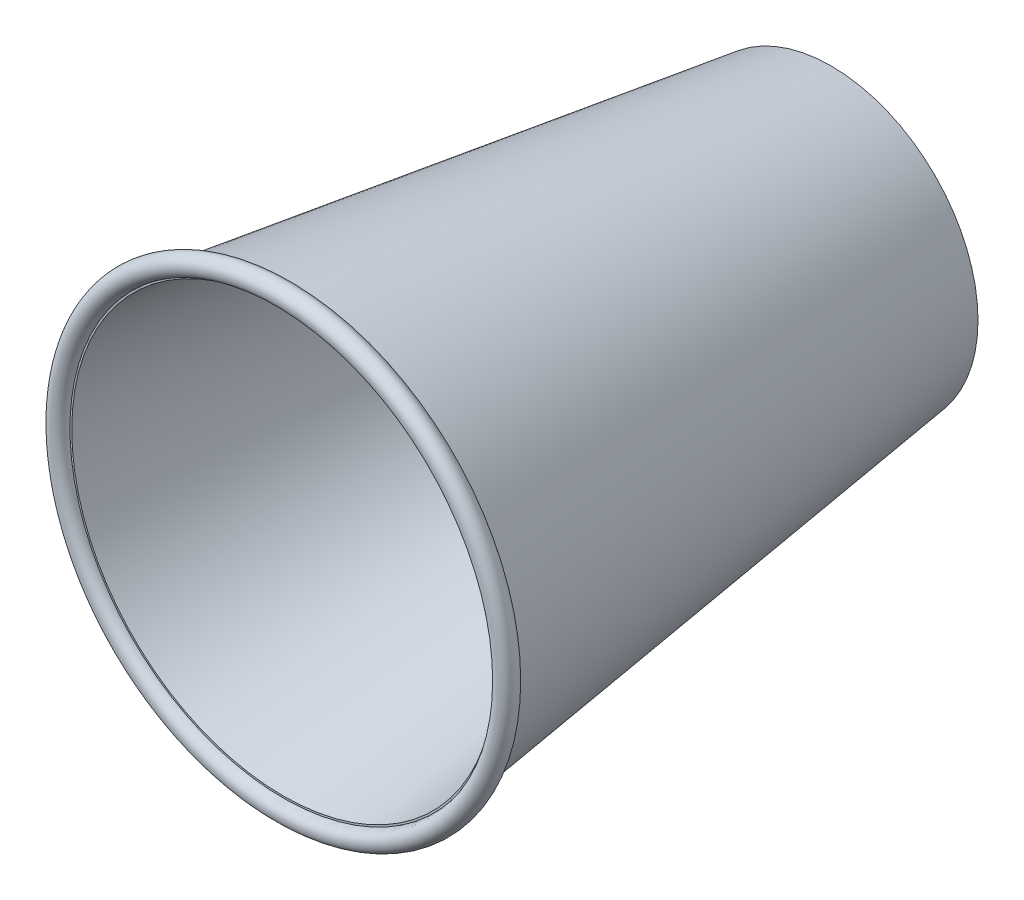
ISO-10303-21;
HEADER;
FILE_DESCRIPTION(('STEP AP214'),'2;1');
FILE_NAME('part.step','',(''),(''),'','','');
FILE_SCHEMA(('AUTOMOTIVE_DESIGN { 1 0 10303 214 1 1 1 1 }'));
ENDSEC;
DATA;
#1=APPLICATION_CONTEXT('core data for automotive mechanical design processes');
#2=APPLICATION_PROTOCOL_DEFINITION('international standard','automotive_design',2000,#1);
#3=PRODUCT_CONTEXT('',#1,'mechanical');
#4=PRODUCT('Part','Part','',(#3));
#5=PRODUCT_RELATED_PRODUCT_CATEGORY('part','',(#4));
#6=PRODUCT_DEFINITION_FORMATION('','',#4);
#7=PRODUCT_DEFINITION_CONTEXT('part definition',#1,'design');
#8=PRODUCT_DEFINITION('design','',#6,#7);
#9=PRODUCT_DEFINITION_SHAPE('','',#8);
#10=(LENGTH_UNIT() NAMED_UNIT(*) SI_UNIT(.MILLI.,.METRE.));
#11=(NAMED_UNIT(*) PLANE_ANGLE_UNIT() SI_UNIT($,.RADIAN.));
#12=(NAMED_UNIT(*) SI_UNIT($,.STERADIAN.) SOLID_ANGLE_UNIT());
#13=UNCERTAINTY_MEASURE_WITH_UNIT(LENGTH_MEASURE(1.E-05),#10,'distance_accuracy_value','');
#14=(GEOMETRIC_REPRESENTATION_CONTEXT(3) GLOBAL_UNCERTAINTY_ASSIGNED_CONTEXT((#13)) GLOBAL_UNIT_ASSIGNED_CONTEXT((#10,
#11,#12)) REPRESENTATION_CONTEXT('',''));
#15=CARTESIAN_POINT('',(0.,0.,0.));
#16=DIRECTION('',(0.,0.,1.));
#17=DIRECTION('',(1.,0.,0.));
#18=AXIS2_PLACEMENT_3D('',#15,#16,#17);
#19=CARTESIAN_POINT('',(0.,0.,110.4));
#20=DIRECTION('',(0.,0.,1.));
#21=DIRECTION('',(1.,0.,0.));
#22=AXIS2_PLACEMENT_3D('',#19,#20,#21);
#23=CONICAL_SURFACE('',#22,44.616104,0.135425968152299);
#24=CARTESIAN_POINT('',(0.,0.,0.));
#25=DIRECTION('',(0.,0.,-1.));
#26=DIRECTION('',(-1.,0.,0.));
#27=AXIS2_PLACEMENT_3D('',#24,#25,#26);
#28=CIRCLE('',#27,29.573);
#29=CARTESIAN_POINT('',(-29.573,0.,0.));
#30=VERTEX_POINT('',#29);
#31=EDGE_CURVE('E61',#30,#30,#28,.T.);
#32=ORIENTED_EDGE('',*,*,#31,.F.);
#33=EDGE_LOOP('',(#32));
#34=FACE_BOUND('',#33,.T.);
#35=CARTESIAN_POINT('',(0.,0.,108.505839674981));
#36=DIRECTION('',(0.,0.,1.));
#37=DIRECTION('',(1.,0.,0.));
#38=AXIS2_PLACEMENT_3D('',#35,#36,#37);
#39=CIRCLE('',#38,44.3580057141129);
#40=CARTESIAN_POINT('',(44.3580057141129,0.,108.505839674981));
#41=VERTEX_POINT('',#40);
#42=EDGE_CURVE('E10',#41,#41,#39,.T.);
#43=ORIENTED_EDGE('',*,*,#42,.F.);
#44=EDGE_LOOP('',(#43));
#45=FACE_BOUND('',#44,.T.);
#46=ADVANCED_FACE('F41',(#34,#45),#23,.T.);
#47=CARTESIAN_POINT('',(0.,0.,3.));
#48=DIRECTION('',(0.,0.,1.));
#49=DIRECTION('',(1.,0.,0.));
#50=AXIS2_PLACEMENT_3D('',#47,#48,#49);
#51=PLANE('',#50);
#52=CARTESIAN_POINT('',(0.,0.,3.));
#53=DIRECTION('',(0.,0.,-1.));
#54=DIRECTION('',(-1.,0.,0.));
#55=AXIS2_PLACEMENT_3D('',#52,#53,#54);
#56=CIRCLE('',#55,27.6);
#57=CARTESIAN_POINT('',(-27.6,0.,3.));
#58=VERTEX_POINT('',#57);
#59=EDGE_CURVE('E53',#58,#58,#56,.T.);
#60=ORIENTED_EDGE('',*,*,#59,.T.);
#61=EDGE_LOOP('',(#60));
#62=FACE_BOUND('',#61,.T.);
#63=ADVANCED_FACE('F43',(#62),#51,.F.);
#64=CARTESIAN_POINT('',(0.,0.,-50.));
#65=DIRECTION('',(0.,0.,-1.));
#66=DIRECTION('',(-1.,0.,0.));
#67=AXIS2_PLACEMENT_3D('',#64,#65,#66);
#68=CYLINDRICAL_SURFACE('',#67,27.6);
#69=ORIENTED_EDGE('',*,*,#59,.F.);
#70=EDGE_LOOP('',(#69));
#71=FACE_BOUND('',#70,.T.);
#72=CARTESIAN_POINT('',(0.,0.,0.));
#73=DIRECTION('',(0.,0.,-1.));
#74=DIRECTION('',(-1.,0.,0.));
#75=AXIS2_PLACEMENT_3D('',#72,#73,#74);
#76=CIRCLE('',#75,27.6);
#77=CARTESIAN_POINT('',(-27.6,0.,0.));
#78=VERTEX_POINT('',#77);
#79=EDGE_CURVE('E64',#78,#78,#76,.T.);
#80=ORIENTED_EDGE('',*,*,#79,.T.);
#81=EDGE_LOOP('',(#80));
#82=FACE_BOUND('',#81,.T.);
#83=ADVANCED_FACE('F70',(#71,#82),#68,.F.);
#84=CARTESIAN_POINT('',(27.6,0.,0.));
#85=DIRECTION('',(0.,0.,1.));
#86=DIRECTION('',(1.,0.,0.));
#87=AXIS2_PLACEMENT_3D('',#84,#85,#86);
#88=PLANE('',#87);
#89=ORIENTED_EDGE('',*,*,#79,.F.);
#90=EDGE_LOOP('',(#89));
#91=FACE_BOUND('',#90,.T.);
#92=ORIENTED_EDGE('',*,*,#31,.T.);
#93=EDGE_LOOP('',(#92));
#94=FACE_BOUND('',#93,.T.);
#95=ADVANCED_FACE('F73',(#91,#94),#88,.F.);
#96=CARTESIAN_POINT('',(0.,0.,110.4));
#97=DIRECTION('',(0.,0.,-1.));
#98=DIRECTION('',(-1.,0.,0.));
#99=AXIS2_PLACEMENT_3D('',#96,#97,#98);
#100=TOROIDAL_SURFACE('',#99,45.,2.);
#101=CARTESIAN_POINT('',(0.,0.,110.4));
#102=DIRECTION('',(0.,0.,1.));
#103=DIRECTION('',(1.,0.,0.));
#104=AXIS2_PLACEMENT_3D('',#101,#102,#103);
#105=CIRCLE('',#104,43.);
#106=CARTESIAN_POINT('',(43.,0.,110.4));
#107=VERTEX_POINT('',#106);
#108=EDGE_CURVE('E45',#107,#107,#105,.F.);
#109=ORIENTED_EDGE('',*,*,#108,.T.);
#110=EDGE_LOOP('',(#109));
#111=FACE_BOUND('',#110,.T.);
#112=ORIENTED_EDGE('',*,*,#42,.T.);
#113=EDGE_LOOP('',(#112));
#114=FACE_BOUND('',#113,.T.);
#115=ADVANCED_FACE('F78',(#111,#114),#100,.T.);
#116=CARTESIAN_POINT('',(28.23035,0.,5.));
#117=DIRECTION('',(0.,0.,-1.));
#118=DIRECTION('',(-1.,0.,0.));
#119=AXIS2_PLACEMENT_3D('',#116,#117,#118);
#120=PLANE('',#119);
#121=CARTESIAN_POINT('',(0.,0.,5.));
#122=DIRECTION('',(0.,0.,-1.));
#123=DIRECTION('',(-1.,0.,0.));
#124=AXIS2_PLACEMENT_3D('',#121,#122,#123);
#125=CIRCLE('',#124,28.23035);
#126=CARTESIAN_POINT('',(-28.23035,0.,5.));
#127=VERTEX_POINT('',#126);
#128=EDGE_CURVE('E55',#127,#127,#125,.T.);
#129=ORIENTED_EDGE('',*,*,#128,.F.);
#130=EDGE_LOOP('',(#129));
#131=FACE_BOUND('',#130,.T.);
#132=ADVANCED_FACE('F98',(#131),#120,.F.);
#133=CARTESIAN_POINT('',(0.,0.,5.));
#134=DIRECTION('',(0.,0.,1.));
#135=DIRECTION('',(1.,0.,0.));
#136=AXIS2_PLACEMENT_3D('',#133,#134,#135);
#137=CONICAL_SURFACE('',#136,28.23035,0.13582847243214);
#138=CARTESIAN_POINT('',(0.,0.,110.4));
#139=DIRECTION('',(0.,0.,-1.));
#140=DIRECTION('',(-1.,0.,0.));
#141=AXIS2_PLACEMENT_3D('',#138,#139,#140);
#142=CIRCLE('',#141,42.635368);
#143=CARTESIAN_POINT('',(-42.635368,0.,110.4));
#144=VERTEX_POINT('',#143);
#145=EDGE_CURVE('E58',#144,#144,#142,.T.);
#146=ORIENTED_EDGE('',*,*,#145,.F.);
#147=EDGE_LOOP('',(#146));
#148=FACE_BOUND('',#147,.T.);
#149=ORIENTED_EDGE('',*,*,#128,.T.);
#150=EDGE_LOOP('',(#149));
#151=FACE_BOUND('',#150,.T.);
#152=ADVANCED_FACE('F94',(#148,#151),#137,.F.);
#153=CARTESIAN_POINT('',(44.616104,0.,110.4));
#154=DIRECTION('',(0.,0.,-1.));
#155=DIRECTION('',(-1.,0.,0.));
#156=AXIS2_PLACEMENT_3D('',#153,#154,#155);
#157=PLANE('',#156);
#158=ORIENTED_EDGE('',*,*,#145,.T.);
#159=EDGE_LOOP('',(#158));
#160=FACE_BOUND('',#159,.T.);
#161=ORIENTED_EDGE('',*,*,#108,.F.);
#162=EDGE_LOOP('',(#161));
#163=FACE_BOUND('',#162,.T.);
#164=ADVANCED_FACE('F91',(#160,#163),#157,.F.);
#165=CLOSED_SHELL('',(#46,#63,#83,#95,#115,#132,#152,#164));
#166=MANIFOLD_SOLID_BREP('B2',#165);
#167=ADVANCED_BREP_SHAPE_REPRESENTATION('',(#18,#166),#14);
#168=SHAPE_DEFINITION_REPRESENTATION(#9,#167);
ENDSEC;
END-ISO-10303-21;
